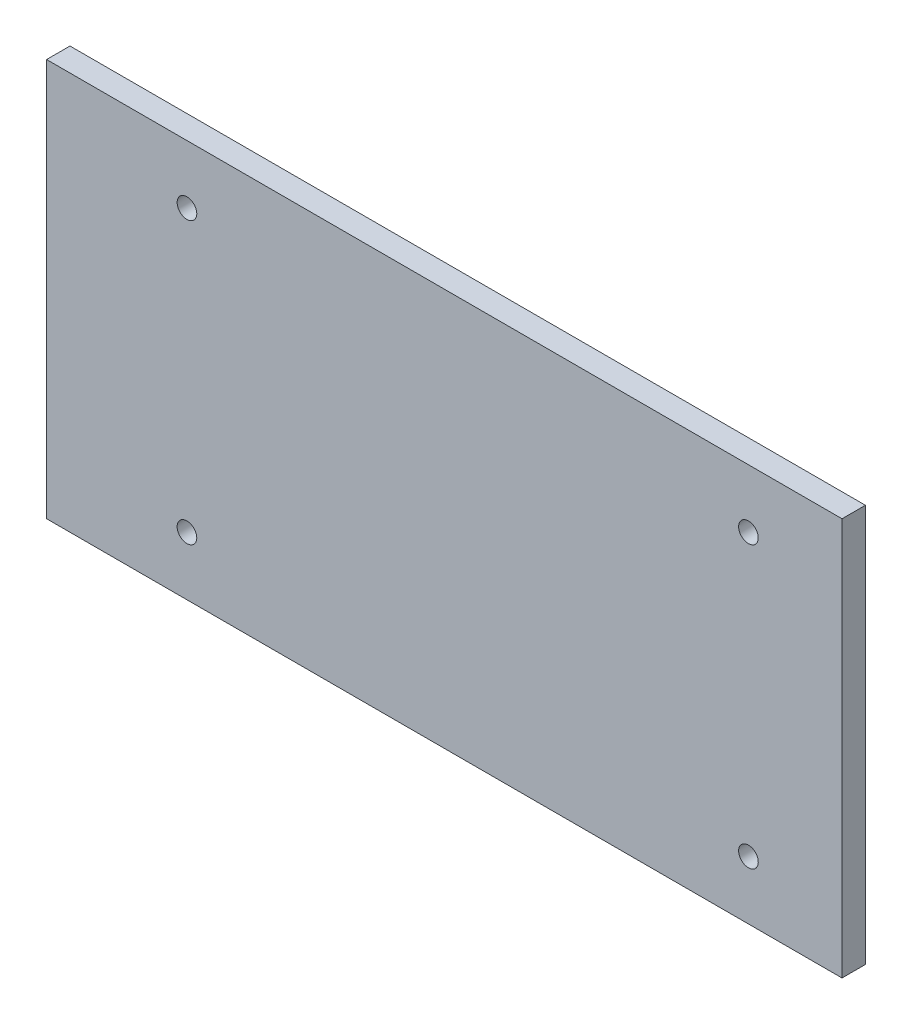
ISO-10303-21;
HEADER;
FILE_DESCRIPTION(('STEP AP214'),'2;1');
FILE_NAME('part.step','',(''),(''),'','','');
FILE_SCHEMA(('AUTOMOTIVE_DESIGN { 1 0 10303 214 1 1 1 1 }'));
ENDSEC;
DATA;
#1=APPLICATION_CONTEXT('core data for automotive mechanical design processes');
#2=APPLICATION_PROTOCOL_DEFINITION('international standard','automotive_design',2000,#1);
#3=PRODUCT_CONTEXT('',#1,'mechanical');
#4=PRODUCT('Part','Part','',(#3));
#5=PRODUCT_RELATED_PRODUCT_CATEGORY('part','',(#4));
#6=PRODUCT_DEFINITION_FORMATION('','',#4);
#7=PRODUCT_DEFINITION_CONTEXT('part definition',#1,'design');
#8=PRODUCT_DEFINITION('design','',#6,#7);
#9=PRODUCT_DEFINITION_SHAPE('','',#8);
#10=(LENGTH_UNIT() NAMED_UNIT(*) SI_UNIT(.MILLI.,.METRE.));
#11=(NAMED_UNIT(*) PLANE_ANGLE_UNIT() SI_UNIT($,.RADIAN.));
#12=(NAMED_UNIT(*) SI_UNIT($,.STERADIAN.) SOLID_ANGLE_UNIT());
#13=UNCERTAINTY_MEASURE_WITH_UNIT(LENGTH_MEASURE(1.E-05),#10,'distance_accuracy_value','');
#14=(GEOMETRIC_REPRESENTATION_CONTEXT(3) GLOBAL_UNCERTAINTY_ASSIGNED_CONTEXT((#13)) GLOBAL_UNIT_ASSIGNED_CONTEXT((#10,
#11,#12)) REPRESENTATION_CONTEXT('',''));
#15=CARTESIAN_POINT('',(0.,0.,0.));
#16=DIRECTION('',(0.,0.,1.));
#17=DIRECTION('',(1.,0.,0.));
#18=AXIS2_PLACEMENT_3D('',#15,#16,#17);
#19=CARTESIAN_POINT('',(0.,0.,5.));
#20=DIRECTION('',(0.,0.,-1.));
#21=DIRECTION('',(-1.,0.,0.));
#22=AXIS2_PLACEMENT_3D('',#19,#20,#21);
#23=PLANE('',#22);
#24=DIRECTION('',(-1.,0.,0.));
#25=VECTOR('',#24,1.);
#26=CARTESIAN_POINT('',(85.,42.5,5.));
#27=LINE('',#26,#25);
#28=CARTESIAN_POINT('',(85.,42.5,5.));
#29=VERTEX_POINT('',#28);
#30=CARTESIAN_POINT('',(-85.,42.5,5.));
#31=VERTEX_POINT('',#30);
#32=EDGE_CURVE('E93',#29,#31,#27,.T.);
#33=ORIENTED_EDGE('',*,*,#32,.T.);
#34=DIRECTION('',(0.,-1.,0.));
#35=VECTOR('',#34,1.);
#36=CARTESIAN_POINT('',(-85.,-42.5,5.));
#37=LINE('',#36,#35);
#38=CARTESIAN_POINT('',(-85.,-42.5,5.));
#39=VERTEX_POINT('',#38);
#40=EDGE_CURVE('E88',#31,#39,#37,.T.);
#41=ORIENTED_EDGE('',*,*,#40,.T.);
#42=DIRECTION('',(1.,0.,0.));
#43=VECTOR('',#42,1.);
#44=CARTESIAN_POINT('',(85.,-42.5,5.));
#45=LINE('',#44,#43);
#46=CARTESIAN_POINT('',(85.,-42.5,5.));
#47=VERTEX_POINT('',#46);
#48=EDGE_CURVE('E90',#39,#47,#45,.T.);
#49=ORIENTED_EDGE('',*,*,#48,.T.);
#50=DIRECTION('',(0.,1.,0.));
#51=VECTOR('',#50,1.);
#52=CARTESIAN_POINT('',(85.,-42.5,5.));
#53=LINE('',#52,#51);
#54=EDGE_CURVE('E57',#47,#29,#53,.T.);
#55=ORIENTED_EDGE('',*,*,#54,.T.);
#56=EDGE_LOOP('',(#33,#41,#49,#55));
#57=FACE_BOUND('',#56,.T.);
#58=CARTESIAN_POINT('',(-55.,-30.,5.));
#59=DIRECTION('',(0.,0.,1.));
#60=DIRECTION('',(1.,0.,0.));
#61=AXIS2_PLACEMENT_3D('',#58,#59,#60);
#62=CIRCLE('',#61,2.1);
#63=CARTESIAN_POINT('',(-52.9,-30.,5.));
#64=VERTEX_POINT('',#63);
#65=EDGE_CURVE('E106',#64,#64,#62,.T.);
#66=ORIENTED_EDGE('',*,*,#65,.F.);
#67=EDGE_LOOP('',(#66));
#68=FACE_BOUND('',#67,.T.);
#69=CARTESIAN_POINT('',(65.,-30.,5.));
#70=DIRECTION('',(0.,0.,1.));
#71=DIRECTION('',(1.,0.,0.));
#72=AXIS2_PLACEMENT_3D('',#69,#70,#71);
#73=CIRCLE('',#72,2.1);
#74=CARTESIAN_POINT('',(67.1,-30.,5.));
#75=VERTEX_POINT('',#74);
#76=EDGE_CURVE('E123',#75,#75,#73,.T.);
#77=ORIENTED_EDGE('',*,*,#76,.F.);
#78=EDGE_LOOP('',(#77));
#79=FACE_BOUND('',#78,.T.);
#80=CARTESIAN_POINT('',(65.,30.,5.));
#81=DIRECTION('',(0.,0.,1.));
#82=DIRECTION('',(-1.,0.,0.));
#83=AXIS2_PLACEMENT_3D('',#80,#81,#82);
#84=CIRCLE('',#83,2.10000000000001);
#85=CARTESIAN_POINT('',(62.9,30.,5.));
#86=VERTEX_POINT('',#85);
#87=EDGE_CURVE('E130',#86,#86,#84,.T.);
#88=ORIENTED_EDGE('',*,*,#87,.F.);
#89=EDGE_LOOP('',(#88));
#90=FACE_BOUND('',#89,.T.);
#91=CARTESIAN_POINT('',(-55.,30.,5.));
#92=DIRECTION('',(0.,0.,1.));
#93=DIRECTION('',(-1.,0.,0.));
#94=AXIS2_PLACEMENT_3D('',#91,#92,#93);
#95=CIRCLE('',#94,2.10000000000001);
#96=CARTESIAN_POINT('',(-57.1,30.,5.));
#97=VERTEX_POINT('',#96);
#98=EDGE_CURVE('E134',#97,#97,#95,.T.);
#99=ORIENTED_EDGE('',*,*,#98,.F.);
#100=EDGE_LOOP('',(#99));
#101=FACE_BOUND('',#100,.T.);
#102=ADVANCED_FACE('F39',(#57,#68,#79,#90,#101),#23,.F.);
#103=CARTESIAN_POINT('',(0.,0.,0.));
#104=DIRECTION('',(0.,0.,-1.));
#105=DIRECTION('',(-1.,0.,0.));
#106=AXIS2_PLACEMENT_3D('',#103,#104,#105);
#107=PLANE('',#106);
#108=CARTESIAN_POINT('',(65.,30.,0.));
#109=DIRECTION('',(0.,0.,1.));
#110=DIRECTION('',(-1.,0.,0.));
#111=AXIS2_PLACEMENT_3D('',#108,#109,#110);
#112=CIRCLE('',#111,2.10000000000001);
#113=CARTESIAN_POINT('',(62.9,30.,0.));
#114=VERTEX_POINT('',#113);
#115=EDGE_CURVE('E128',#114,#114,#112,.T.);
#116=ORIENTED_EDGE('',*,*,#115,.T.);
#117=EDGE_LOOP('',(#116));
#118=FACE_BOUND('',#117,.T.);
#119=CARTESIAN_POINT('',(-55.,-30.,0.));
#120=DIRECTION('',(0.,0.,1.));
#121=DIRECTION('',(1.,0.,0.));
#122=AXIS2_PLACEMENT_3D('',#119,#120,#121);
#123=CIRCLE('',#122,2.1);
#124=CARTESIAN_POINT('',(-52.9,-30.,0.));
#125=VERTEX_POINT('',#124);
#126=EDGE_CURVE('E119',#125,#125,#123,.T.);
#127=ORIENTED_EDGE('',*,*,#126,.T.);
#128=EDGE_LOOP('',(#127));
#129=FACE_BOUND('',#128,.T.);
#130=DIRECTION('',(-1.,0.,0.));
#131=VECTOR('',#130,1.);
#132=CARTESIAN_POINT('',(85.,42.5,0.));
#133=LINE('',#132,#131);
#134=CARTESIAN_POINT('',(85.,42.5,0.));
#135=VERTEX_POINT('',#134);
#136=CARTESIAN_POINT('',(-85.,42.5,0.));
#137=VERTEX_POINT('',#136);
#138=EDGE_CURVE('E103',#135,#137,#133,.T.);
#139=ORIENTED_EDGE('',*,*,#138,.F.);
#140=DIRECTION('',(0.,1.,0.));
#141=VECTOR('',#140,1.);
#142=CARTESIAN_POINT('',(85.,-42.5,0.));
#143=LINE('',#142,#141);
#144=CARTESIAN_POINT('',(85.,-42.5,0.));
#145=VERTEX_POINT('',#144);
#146=EDGE_CURVE('E76',#145,#135,#143,.T.);
#147=ORIENTED_EDGE('',*,*,#146,.F.);
#148=DIRECTION('',(1.,0.,0.));
#149=VECTOR('',#148,1.);
#150=CARTESIAN_POINT('',(85.,-42.5,0.));
#151=LINE('',#150,#149);
#152=CARTESIAN_POINT('',(-85.,-42.5,0.));
#153=VERTEX_POINT('',#152);
#154=EDGE_CURVE('E71',#153,#145,#151,.T.);
#155=ORIENTED_EDGE('',*,*,#154,.F.);
#156=DIRECTION('',(0.,-1.,0.));
#157=VECTOR('',#156,1.);
#158=CARTESIAN_POINT('',(-85.,-42.5,0.));
#159=LINE('',#158,#157);
#160=EDGE_CURVE('E92',#137,#153,#159,.T.);
#161=ORIENTED_EDGE('',*,*,#160,.F.);
#162=EDGE_LOOP('',(#139,#147,#155,#161));
#163=FACE_BOUND('',#162,.T.);
#164=CARTESIAN_POINT('',(65.,-30.,0.));
#165=DIRECTION('',(0.,0.,1.));
#166=DIRECTION('',(1.,0.,0.));
#167=AXIS2_PLACEMENT_3D('',#164,#165,#166);
#168=CIRCLE('',#167,2.1);
#169=CARTESIAN_POINT('',(67.1,-30.,0.));
#170=VERTEX_POINT('',#169);
#171=EDGE_CURVE('E124',#170,#170,#168,.T.);
#172=ORIENTED_EDGE('',*,*,#171,.T.);
#173=EDGE_LOOP('',(#172));
#174=FACE_BOUND('',#173,.T.);
#175=CARTESIAN_POINT('',(-55.,30.,0.));
#176=DIRECTION('',(0.,0.,1.));
#177=DIRECTION('',(-1.,0.,0.));
#178=AXIS2_PLACEMENT_3D('',#175,#176,#177);
#179=CIRCLE('',#178,2.10000000000001);
#180=CARTESIAN_POINT('',(-57.1,30.,0.));
#181=VERTEX_POINT('',#180);
#182=EDGE_CURVE('E138',#181,#181,#179,.T.);
#183=ORIENTED_EDGE('',*,*,#182,.T.);
#184=EDGE_LOOP('',(#183));
#185=FACE_BOUND('',#184,.T.);
#186=ADVANCED_FACE('F111',(#118,#129,#163,#174,#185),#107,.T.);
#187=CARTESIAN_POINT('',(85.,42.5,5.));
#188=DIRECTION('',(0.,-1.,0.));
#189=DIRECTION('',(0.,0.,-1.));
#190=AXIS2_PLACEMENT_3D('',#187,#188,#189);
#191=PLANE('',#190);
#192=ORIENTED_EDGE('',*,*,#138,.T.);
#193=DIRECTION('',(0.,0.,-1.));
#194=VECTOR('',#193,1.);
#195=CARTESIAN_POINT('',(-85.,42.5,5.));
#196=LINE('',#195,#194);
#197=EDGE_CURVE('E11',#31,#137,#196,.T.);
#198=ORIENTED_EDGE('',*,*,#197,.F.);
#199=ORIENTED_EDGE('',*,*,#32,.F.);
#200=DIRECTION('',(0.,0.,-1.));
#201=VECTOR('',#200,1.);
#202=CARTESIAN_POINT('',(85.,42.5,5.));
#203=LINE('',#202,#201);
#204=EDGE_CURVE('E97',#29,#135,#203,.T.);
#205=ORIENTED_EDGE('',*,*,#204,.T.);
#206=EDGE_LOOP('',(#192,#198,#199,#205));
#207=FACE_BOUND('',#206,.T.);
#208=ADVANCED_FACE('F41',(#207),#191,.F.);
#209=CARTESIAN_POINT('',(-85.,-42.5,5.));
#210=DIRECTION('',(1.,0.,0.));
#211=DIRECTION('',(0.,0.,-1.));
#212=AXIS2_PLACEMENT_3D('',#209,#210,#211);
#213=PLANE('',#212);
#214=ORIENTED_EDGE('',*,*,#160,.T.);
#215=DIRECTION('',(0.,0.,-1.));
#216=VECTOR('',#215,1.);
#217=CARTESIAN_POINT('',(-85.,-42.5,5.));
#218=LINE('',#217,#216);
#219=EDGE_CURVE('E48',#39,#153,#218,.T.);
#220=ORIENTED_EDGE('',*,*,#219,.F.);
#221=ORIENTED_EDGE('',*,*,#40,.F.);
#222=ORIENTED_EDGE('',*,*,#197,.T.);
#223=EDGE_LOOP('',(#214,#220,#221,#222));
#224=FACE_BOUND('',#223,.T.);
#225=ADVANCED_FACE('F94',(#224),#213,.F.);
#226=CARTESIAN_POINT('',(85.,-42.5,5.));
#227=DIRECTION('',(0.,1.,0.));
#228=DIRECTION('',(0.,0.,1.));
#229=AXIS2_PLACEMENT_3D('',#226,#227,#228);
#230=PLANE('',#229);
#231=ORIENTED_EDGE('',*,*,#154,.T.);
#232=DIRECTION('',(0.,0.,-1.));
#233=VECTOR('',#232,1.);
#234=CARTESIAN_POINT('',(85.,-42.5,5.));
#235=LINE('',#234,#233);
#236=EDGE_CURVE('E96',#47,#145,#235,.T.);
#237=ORIENTED_EDGE('',*,*,#236,.F.);
#238=ORIENTED_EDGE('',*,*,#48,.F.);
#239=ORIENTED_EDGE('',*,*,#219,.T.);
#240=EDGE_LOOP('',(#231,#237,#238,#239));
#241=FACE_BOUND('',#240,.T.);
#242=ADVANCED_FACE('F100',(#241),#230,.F.);
#243=CARTESIAN_POINT('',(85.,-42.5,5.));
#244=DIRECTION('',(-1.,0.,0.));
#245=DIRECTION('',(0.,0.,1.));
#246=AXIS2_PLACEMENT_3D('',#243,#244,#245);
#247=PLANE('',#246);
#248=ORIENTED_EDGE('',*,*,#146,.T.);
#249=ORIENTED_EDGE('',*,*,#204,.F.);
#250=ORIENTED_EDGE('',*,*,#54,.F.);
#251=ORIENTED_EDGE('',*,*,#236,.T.);
#252=EDGE_LOOP('',(#248,#249,#250,#251));
#253=FACE_BOUND('',#252,.T.);
#254=ADVANCED_FACE('F112',(#253),#247,.F.);
#255=CARTESIAN_POINT('',(-55.,-30.,5.));
#256=DIRECTION('',(0.,0.,-1.));
#257=DIRECTION('',(-1.,0.,0.));
#258=AXIS2_PLACEMENT_3D('',#255,#256,#257);
#259=CYLINDRICAL_SURFACE('',#258,2.1);
#260=ORIENTED_EDGE('',*,*,#65,.T.);
#261=EDGE_LOOP('',(#260));
#262=FACE_BOUND('',#261,.T.);
#263=ORIENTED_EDGE('',*,*,#126,.F.);
#264=EDGE_LOOP('',(#263));
#265=FACE_BOUND('',#264,.T.);
#266=ADVANCED_FACE('F153',(#262,#265),#259,.F.);
#267=CARTESIAN_POINT('',(65.,-30.,5.));
#268=DIRECTION('',(0.,0.,-1.));
#269=DIRECTION('',(-1.,0.,0.));
#270=AXIS2_PLACEMENT_3D('',#267,#268,#269);
#271=CYLINDRICAL_SURFACE('',#270,2.1);
#272=ORIENTED_EDGE('',*,*,#76,.T.);
#273=EDGE_LOOP('',(#272));
#274=FACE_BOUND('',#273,.T.);
#275=ORIENTED_EDGE('',*,*,#171,.F.);
#276=EDGE_LOOP('',(#275));
#277=FACE_BOUND('',#276,.T.);
#278=ADVANCED_FACE('F196',(#274,#277),#271,.F.);
#279=CARTESIAN_POINT('',(65.,30.,5.));
#280=DIRECTION('',(0.,0.,-1.));
#281=DIRECTION('',(-1.,0.,0.));
#282=AXIS2_PLACEMENT_3D('',#279,#280,#281);
#283=CYLINDRICAL_SURFACE('',#282,2.10000000000001);
#284=ORIENTED_EDGE('',*,*,#87,.T.);
#285=EDGE_LOOP('',(#284));
#286=FACE_BOUND('',#285,.T.);
#287=ORIENTED_EDGE('',*,*,#115,.F.);
#288=EDGE_LOOP('',(#287));
#289=FACE_BOUND('',#288,.T.);
#290=ADVANCED_FACE('F206',(#286,#289),#283,.F.);
#291=CARTESIAN_POINT('',(-55.,30.,5.));
#292=DIRECTION('',(0.,0.,-1.));
#293=DIRECTION('',(-1.,0.,0.));
#294=AXIS2_PLACEMENT_3D('',#291,#292,#293);
#295=CYLINDRICAL_SURFACE('',#294,2.10000000000001);
#296=ORIENTED_EDGE('',*,*,#98,.T.);
#297=EDGE_LOOP('',(#296));
#298=FACE_BOUND('',#297,.T.);
#299=ORIENTED_EDGE('',*,*,#182,.F.);
#300=EDGE_LOOP('',(#299));
#301=FACE_BOUND('',#300,.T.);
#302=ADVANCED_FACE('F142',(#298,#301),#295,.F.);
#303=CLOSED_SHELL('',(#102,#186,#208,#225,#242,#254,#266,#278,#290,#302));
#304=MANIFOLD_SOLID_BREP('B2',#303);
#305=ADVANCED_BREP_SHAPE_REPRESENTATION('',(#18,#304),#14);
#306=SHAPE_DEFINITION_REPRESENTATION(#9,#305);
ENDSEC;
END-ISO-10303-21;
